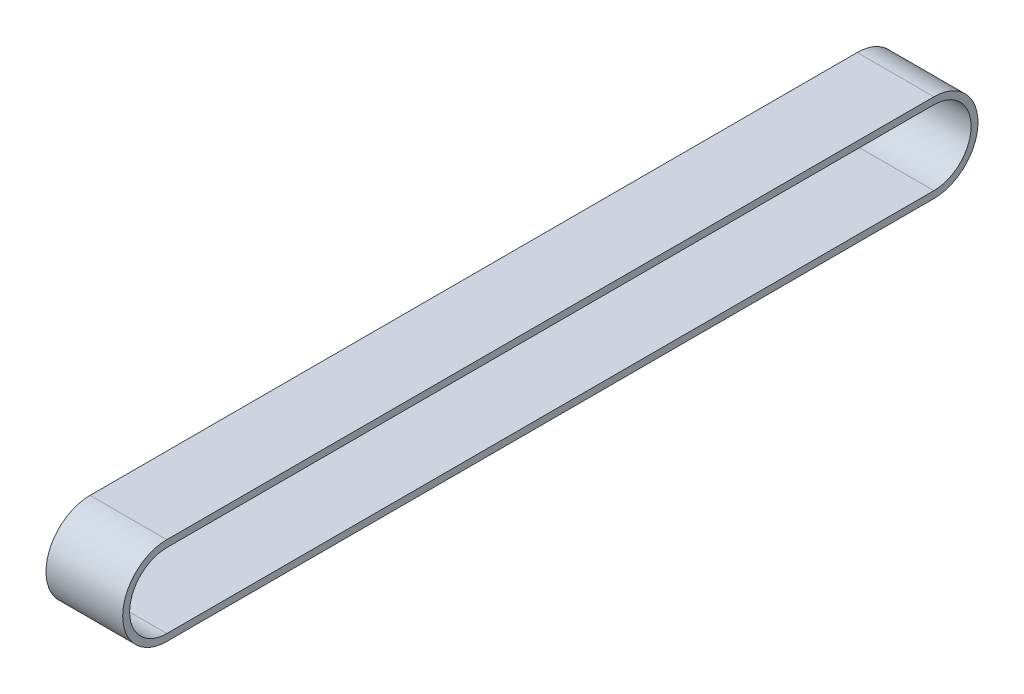
ISO-10303-21;
HEADER;
FILE_DESCRIPTION(('STEP AP214'),'2;1');
FILE_NAME('part.step','',(''),(''),'','','');
FILE_SCHEMA(('AUTOMOTIVE_DESIGN { 1 0 10303 214 1 1 1 1 }'));
ENDSEC;
DATA;
#1=APPLICATION_CONTEXT('core data for automotive mechanical design processes');
#2=APPLICATION_PROTOCOL_DEFINITION('international standard','automotive_design',2000,#1);
#3=PRODUCT_CONTEXT('',#1,'mechanical');
#4=PRODUCT('Part','Part','',(#3));
#5=PRODUCT_RELATED_PRODUCT_CATEGORY('part','',(#4));
#6=PRODUCT_DEFINITION_FORMATION('','',#4);
#7=PRODUCT_DEFINITION_CONTEXT('part definition',#1,'design');
#8=PRODUCT_DEFINITION('design','',#6,#7);
#9=PRODUCT_DEFINITION_SHAPE('','',#8);
#10=(LENGTH_UNIT() NAMED_UNIT(*) SI_UNIT(.MILLI.,.METRE.));
#11=(NAMED_UNIT(*) PLANE_ANGLE_UNIT() SI_UNIT($,.RADIAN.));
#12=(NAMED_UNIT(*) SI_UNIT($,.STERADIAN.) SOLID_ANGLE_UNIT());
#13=UNCERTAINTY_MEASURE_WITH_UNIT(LENGTH_MEASURE(1.E-05),#10,'distance_accuracy_value','');
#14=(GEOMETRIC_REPRESENTATION_CONTEXT(3) GLOBAL_UNCERTAINTY_ASSIGNED_CONTEXT((#13)) GLOBAL_UNIT_ASSIGNED_CONTEXT((#10,
#11,#12)) REPRESENTATION_CONTEXT('',''));
#15=CARTESIAN_POINT('',(0.,0.,0.));
#16=DIRECTION('',(0.,0.,1.));
#17=DIRECTION('',(1.,0.,0.));
#18=AXIS2_PLACEMENT_3D('',#15,#16,#17);
#19=CARTESIAN_POINT('',(12.7,0.,127.));
#20=DIRECTION('',(1.,0.,0.));
#21=DIRECTION('',(0.,0.,-1.));
#22=AXIS2_PLACEMENT_3D('',#19,#20,#21);
#23=PLANE('',#22);
#24=CARTESIAN_POINT('',(12.7,0.,127.));
#25=DIRECTION('',(1.,0.,0.));
#26=DIRECTION('',(0.,0.,-1.));
#27=AXIS2_PLACEMENT_3D('',#24,#25,#26);
#28=CIRCLE('',#27,14.605);
#29=CARTESIAN_POINT('',(12.7,14.605,127.));
#30=VERTEX_POINT('',#29);
#31=CARTESIAN_POINT('',(12.7,-14.605,127.));
#32=VERTEX_POINT('',#31);
#33=EDGE_CURVE('E140',#30,#32,#28,.T.);
#34=ORIENTED_EDGE('',*,*,#33,.T.);
#35=DIRECTION('',(0.,0.,-1.));
#36=VECTOR('',#35,1.);
#37=CARTESIAN_POINT('',(12.7,-14.605,127.));
#38=LINE('',#37,#36);
#39=CARTESIAN_POINT('',(12.7,-14.605,-127.));
#40=VERTEX_POINT('',#39);
#41=EDGE_CURVE('E143',#32,#40,#38,.T.);
#42=ORIENTED_EDGE('',*,*,#41,.T.);
#43=CARTESIAN_POINT('',(12.7,0.,-127.));
#44=DIRECTION('',(1.,0.,0.));
#45=DIRECTION('',(0.,0.,-1.));
#46=AXIS2_PLACEMENT_3D('',#43,#44,#45);
#47=CIRCLE('',#46,14.605);
#48=CARTESIAN_POINT('',(12.7,14.6050000000001,-127.));
#49=VERTEX_POINT('',#48);
#50=EDGE_CURVE('E146',#40,#49,#47,.T.);
#51=ORIENTED_EDGE('',*,*,#50,.T.);
#52=DIRECTION('',(0.,0.,1.));
#53=VECTOR('',#52,1.);
#54=CARTESIAN_POINT('',(12.7,14.605,127.));
#55=LINE('',#54,#53);
#56=EDGE_CURVE('E148',#49,#30,#55,.T.);
#57=ORIENTED_EDGE('',*,*,#56,.T.);
#58=EDGE_LOOP('',(#34,#42,#51,#57));
#59=FACE_BOUND('',#58,.T.);
#60=DIRECTION('',(0.,0.,-1.));
#61=VECTOR('',#60,1.);
#62=CARTESIAN_POINT('',(12.7,-12.319,127.));
#63=LINE('',#62,#61);
#64=CARTESIAN_POINT('',(12.7,-12.319,127.));
#65=VERTEX_POINT('',#64);
#66=CARTESIAN_POINT('',(12.7,-12.319,-127.));
#67=VERTEX_POINT('',#66);
#68=EDGE_CURVE('E112',#65,#67,#63,.T.);
#69=ORIENTED_EDGE('',*,*,#68,.F.);
#70=CARTESIAN_POINT('',(12.7,0.,127.));
#71=DIRECTION('',(1.,0.,0.));
#72=DIRECTION('',(0.,0.,-1.));
#73=AXIS2_PLACEMENT_3D('',#70,#71,#72);
#74=CIRCLE('',#73,12.319);
#75=CARTESIAN_POINT('',(12.7,12.319,127.));
#76=VERTEX_POINT('',#75);
#77=EDGE_CURVE('E104',#76,#65,#74,.T.);
#78=ORIENTED_EDGE('',*,*,#77,.F.);
#79=DIRECTION('',(0.,0.,1.));
#80=VECTOR('',#79,1.);
#81=CARTESIAN_POINT('',(12.7,12.319,127.));
#82=LINE('',#81,#80);
#83=CARTESIAN_POINT('',(12.7,12.3190000000001,-127.));
#84=VERTEX_POINT('',#83);
#85=EDGE_CURVE('E126',#84,#76,#82,.T.);
#86=ORIENTED_EDGE('',*,*,#85,.F.);
#87=CARTESIAN_POINT('',(12.7,0.,-127.));
#88=DIRECTION('',(1.,0.,0.));
#89=DIRECTION('',(0.,0.,-1.));
#90=AXIS2_PLACEMENT_3D('',#87,#88,#89);
#91=CIRCLE('',#90,12.319);
#92=EDGE_CURVE('E124',#67,#84,#91,.T.);
#93=ORIENTED_EDGE('',*,*,#92,.F.);
#94=EDGE_LOOP('',(#69,#78,#86,#93));
#95=FACE_BOUND('',#94,.T.);
#96=ADVANCED_FACE('F39',(#59,#95),#23,.T.);
#97=CARTESIAN_POINT('',(-12.7,0.,127.));
#98=DIRECTION('',(1.,0.,0.));
#99=DIRECTION('',(0.,0.,-1.));
#100=AXIS2_PLACEMENT_3D('',#97,#98,#99);
#101=PLANE('',#100);
#102=CARTESIAN_POINT('',(-12.7,0.,127.));
#103=DIRECTION('',(1.,0.,0.));
#104=DIRECTION('',(0.,0.,-1.));
#105=AXIS2_PLACEMENT_3D('',#102,#103,#104);
#106=CIRCLE('',#105,14.605);
#107=CARTESIAN_POINT('',(-12.7,14.605,127.));
#108=VERTEX_POINT('',#107);
#109=CARTESIAN_POINT('',(-12.7,-14.605,127.));
#110=VERTEX_POINT('',#109);
#111=EDGE_CURVE('E120',#108,#110,#106,.T.);
#112=ORIENTED_EDGE('',*,*,#111,.F.);
#113=DIRECTION('',(0.,0.,1.));
#114=VECTOR('',#113,1.);
#115=CARTESIAN_POINT('',(-12.7,14.605,127.));
#116=LINE('',#115,#114);
#117=CARTESIAN_POINT('',(-12.7,14.6050000000001,-127.));
#118=VERTEX_POINT('',#117);
#119=EDGE_CURVE('E144',#118,#108,#116,.T.);
#120=ORIENTED_EDGE('',*,*,#119,.F.);
#121=CARTESIAN_POINT('',(-12.7,0.,-127.));
#122=DIRECTION('',(1.,0.,0.));
#123=DIRECTION('',(0.,0.,-1.));
#124=AXIS2_PLACEMENT_3D('',#121,#122,#123);
#125=CIRCLE('',#124,14.605);
#126=CARTESIAN_POINT('',(-12.7,-14.605,-127.));
#127=VERTEX_POINT('',#126);
#128=EDGE_CURVE('E155',#127,#118,#125,.T.);
#129=ORIENTED_EDGE('',*,*,#128,.F.);
#130=DIRECTION('',(0.,0.,-1.));
#131=VECTOR('',#130,1.);
#132=CARTESIAN_POINT('',(-12.7,-14.605,127.));
#133=LINE('',#132,#131);
#134=EDGE_CURVE('E153',#110,#127,#133,.T.);
#135=ORIENTED_EDGE('',*,*,#134,.F.);
#136=EDGE_LOOP('',(#112,#120,#129,#135));
#137=FACE_BOUND('',#136,.T.);
#138=CARTESIAN_POINT('',(-12.7,0.,127.));
#139=DIRECTION('',(1.,0.,0.));
#140=DIRECTION('',(0.,0.,-1.));
#141=AXIS2_PLACEMENT_3D('',#138,#139,#140);
#142=CIRCLE('',#141,12.319);
#143=CARTESIAN_POINT('',(-12.7,12.319,127.));
#144=VERTEX_POINT('',#143);
#145=CARTESIAN_POINT('',(-12.7,-12.319,127.));
#146=VERTEX_POINT('',#145);
#147=EDGE_CURVE('E62',#144,#146,#142,.T.);
#148=ORIENTED_EDGE('',*,*,#147,.T.);
#149=DIRECTION('',(0.,0.,-1.));
#150=VECTOR('',#149,1.);
#151=CARTESIAN_POINT('',(-12.7,-12.319,127.));
#152=LINE('',#151,#150);
#153=CARTESIAN_POINT('',(-12.7,-12.319,-127.));
#154=VERTEX_POINT('',#153);
#155=EDGE_CURVE('E119',#146,#154,#152,.T.);
#156=ORIENTED_EDGE('',*,*,#155,.T.);
#157=CARTESIAN_POINT('',(-12.7,0.,-127.));
#158=DIRECTION('',(1.,0.,0.));
#159=DIRECTION('',(0.,0.,-1.));
#160=AXIS2_PLACEMENT_3D('',#157,#158,#159);
#161=CIRCLE('',#160,12.319);
#162=CARTESIAN_POINT('',(-12.7,12.3190000000001,-127.));
#163=VERTEX_POINT('',#162);
#164=EDGE_CURVE('E132',#154,#163,#161,.T.);
#165=ORIENTED_EDGE('',*,*,#164,.T.);
#166=DIRECTION('',(0.,0.,1.));
#167=VECTOR('',#166,1.);
#168=CARTESIAN_POINT('',(-12.7,12.319,127.));
#169=LINE('',#168,#167);
#170=EDGE_CURVE('E113',#163,#144,#169,.T.);
#171=ORIENTED_EDGE('',*,*,#170,.T.);
#172=EDGE_LOOP('',(#148,#156,#165,#171));
#173=FACE_BOUND('',#172,.T.);
#174=ADVANCED_FACE('F173',(#137,#173),#101,.F.);
#175=CARTESIAN_POINT('',(12.7,0.,127.));
#176=DIRECTION('',(-1.,0.,0.));
#177=DIRECTION('',(0.,0.,1.));
#178=AXIS2_PLACEMENT_3D('',#175,#176,#177);
#179=CYLINDRICAL_SURFACE('',#178,14.605);
#180=ORIENTED_EDGE('',*,*,#111,.T.);
#181=DIRECTION('',(-1.,0.,0.));
#182=VECTOR('',#181,1.);
#183=CARTESIAN_POINT('',(12.7,-14.605,127.));
#184=LINE('',#183,#182);
#185=EDGE_CURVE('E11',#32,#110,#184,.T.);
#186=ORIENTED_EDGE('',*,*,#185,.F.);
#187=ORIENTED_EDGE('',*,*,#33,.F.);
#188=DIRECTION('',(-1.,0.,0.));
#189=VECTOR('',#188,1.);
#190=CARTESIAN_POINT('',(12.7,14.605,127.));
#191=LINE('',#190,#189);
#192=EDGE_CURVE('E150',#30,#108,#191,.T.);
#193=ORIENTED_EDGE('',*,*,#192,.T.);
#194=EDGE_LOOP('',(#180,#186,#187,#193));
#195=FACE_BOUND('',#194,.T.);
#196=ADVANCED_FACE('F41',(#195),#179,.T.);
#197=CARTESIAN_POINT('',(12.7,-14.605,127.));
#198=DIRECTION('',(0.,1.,0.));
#199=DIRECTION('',(0.,0.,1.));
#200=AXIS2_PLACEMENT_3D('',#197,#198,#199);
#201=PLANE('',#200);
#202=ORIENTED_EDGE('',*,*,#134,.T.);
#203=DIRECTION('',(-1.,0.,0.));
#204=VECTOR('',#203,1.);
#205=CARTESIAN_POINT('',(12.7,-14.605,-127.));
#206=LINE('',#205,#204);
#207=EDGE_CURVE('E47',#40,#127,#206,.T.);
#208=ORIENTED_EDGE('',*,*,#207,.F.);
#209=ORIENTED_EDGE('',*,*,#41,.F.);
#210=ORIENTED_EDGE('',*,*,#185,.T.);
#211=EDGE_LOOP('',(#202,#208,#209,#210));
#212=FACE_BOUND('',#211,.T.);
#213=ADVANCED_FACE('F183',(#212),#201,.F.);
#214=CARTESIAN_POINT('',(12.7,0.,-127.));
#215=DIRECTION('',(-1.,0.,0.));
#216=DIRECTION('',(0.,0.,1.));
#217=AXIS2_PLACEMENT_3D('',#214,#215,#216);
#218=CYLINDRICAL_SURFACE('',#217,14.605);
#219=ORIENTED_EDGE('',*,*,#128,.T.);
#220=DIRECTION('',(-1.,0.,0.));
#221=VECTOR('',#220,1.);
#222=CARTESIAN_POINT('',(12.7,14.6050000000001,-127.));
#223=LINE('',#222,#221);
#224=EDGE_CURVE('E160',#49,#118,#223,.T.);
#225=ORIENTED_EDGE('',*,*,#224,.F.);
#226=ORIENTED_EDGE('',*,*,#50,.F.);
#227=ORIENTED_EDGE('',*,*,#207,.T.);
#228=EDGE_LOOP('',(#219,#225,#226,#227));
#229=FACE_BOUND('',#228,.T.);
#230=ADVANCED_FACE('F167',(#229),#218,.T.);
#231=CARTESIAN_POINT('',(12.7,14.605,127.));
#232=DIRECTION('',(0.,-1.,0.));
#233=DIRECTION('',(0.,0.,-1.));
#234=AXIS2_PLACEMENT_3D('',#231,#232,#233);
#235=PLANE('',#234);
#236=ORIENTED_EDGE('',*,*,#119,.T.);
#237=ORIENTED_EDGE('',*,*,#192,.F.);
#238=ORIENTED_EDGE('',*,*,#56,.F.);
#239=ORIENTED_EDGE('',*,*,#224,.T.);
#240=EDGE_LOOP('',(#236,#237,#238,#239));
#241=FACE_BOUND('',#240,.T.);
#242=ADVANCED_FACE('F177',(#241),#235,.F.);
#243=CARTESIAN_POINT('',(12.7,0.,127.));
#244=DIRECTION('',(-1.,0.,0.));
#245=DIRECTION('',(0.,0.,1.));
#246=AXIS2_PLACEMENT_3D('',#243,#244,#245);
#247=CYLINDRICAL_SURFACE('',#246,12.319);
#248=ORIENTED_EDGE('',*,*,#147,.F.);
#249=DIRECTION('',(-1.,0.,0.));
#250=VECTOR('',#249,1.);
#251=CARTESIAN_POINT('',(12.7,12.319,127.));
#252=LINE('',#251,#250);
#253=EDGE_CURVE('E108',#76,#144,#252,.T.);
#254=ORIENTED_EDGE('',*,*,#253,.F.);
#255=ORIENTED_EDGE('',*,*,#77,.T.);
#256=DIRECTION('',(-1.,0.,0.));
#257=VECTOR('',#256,1.);
#258=CARTESIAN_POINT('',(12.7,-12.319,127.));
#259=LINE('',#258,#257);
#260=EDGE_CURVE('E107',#65,#146,#259,.T.);
#261=ORIENTED_EDGE('',*,*,#260,.T.);
#262=EDGE_LOOP('',(#248,#254,#255,#261));
#263=FACE_BOUND('',#262,.T.);
#264=ADVANCED_FACE('F106',(#263),#247,.F.);
#265=CARTESIAN_POINT('',(12.7,-12.319,127.));
#266=DIRECTION('',(0.,1.,0.));
#267=DIRECTION('',(0.,0.,1.));
#268=AXIS2_PLACEMENT_3D('',#265,#266,#267);
#269=PLANE('',#268);
#270=ORIENTED_EDGE('',*,*,#155,.F.);
#271=ORIENTED_EDGE('',*,*,#260,.F.);
#272=ORIENTED_EDGE('',*,*,#68,.T.);
#273=DIRECTION('',(-1.,0.,0.));
#274=VECTOR('',#273,1.);
#275=CARTESIAN_POINT('',(12.7,-12.319,-127.));
#276=LINE('',#275,#274);
#277=EDGE_CURVE('E121',#67,#154,#276,.T.);
#278=ORIENTED_EDGE('',*,*,#277,.T.);
#279=EDGE_LOOP('',(#270,#271,#272,#278));
#280=FACE_BOUND('',#279,.T.);
#281=ADVANCED_FACE('F116',(#280),#269,.T.);
#282=CARTESIAN_POINT('',(12.7,0.,-127.));
#283=DIRECTION('',(-1.,0.,0.));
#284=DIRECTION('',(0.,0.,1.));
#285=AXIS2_PLACEMENT_3D('',#282,#283,#284);
#286=CYLINDRICAL_SURFACE('',#285,12.319);
#287=ORIENTED_EDGE('',*,*,#164,.F.);
#288=ORIENTED_EDGE('',*,*,#277,.F.);
#289=ORIENTED_EDGE('',*,*,#92,.T.);
#290=DIRECTION('',(-1.,0.,0.));
#291=VECTOR('',#290,1.);
#292=CARTESIAN_POINT('',(12.7,12.3190000000001,-127.));
#293=LINE('',#292,#291);
#294=EDGE_CURVE('E54',#84,#163,#293,.T.);
#295=ORIENTED_EDGE('',*,*,#294,.T.);
#296=EDGE_LOOP('',(#287,#288,#289,#295));
#297=FACE_BOUND('',#296,.T.);
#298=ADVANCED_FACE('F206',(#297),#286,.F.);
#299=CARTESIAN_POINT('',(12.7,12.319,127.));
#300=DIRECTION('',(0.,-1.,0.));
#301=DIRECTION('',(0.,0.,-1.));
#302=AXIS2_PLACEMENT_3D('',#299,#300,#301);
#303=PLANE('',#302);
#304=ORIENTED_EDGE('',*,*,#170,.F.);
#305=ORIENTED_EDGE('',*,*,#294,.F.);
#306=ORIENTED_EDGE('',*,*,#85,.T.);
#307=ORIENTED_EDGE('',*,*,#253,.T.);
#308=EDGE_LOOP('',(#304,#305,#306,#307));
#309=FACE_BOUND('',#308,.T.);
#310=ADVANCED_FACE('F210',(#309),#303,.T.);
#311=CLOSED_SHELL('',(#96,#174,#196,#213,#230,#242,#264,#281,#298,#310));
#312=MANIFOLD_SOLID_BREP('B2',#311);
#313=ADVANCED_BREP_SHAPE_REPRESENTATION('',(#18,#312),#14);
#314=SHAPE_DEFINITION_REPRESENTATION(#9,#313);
ENDSEC;
END-ISO-10303-21;
